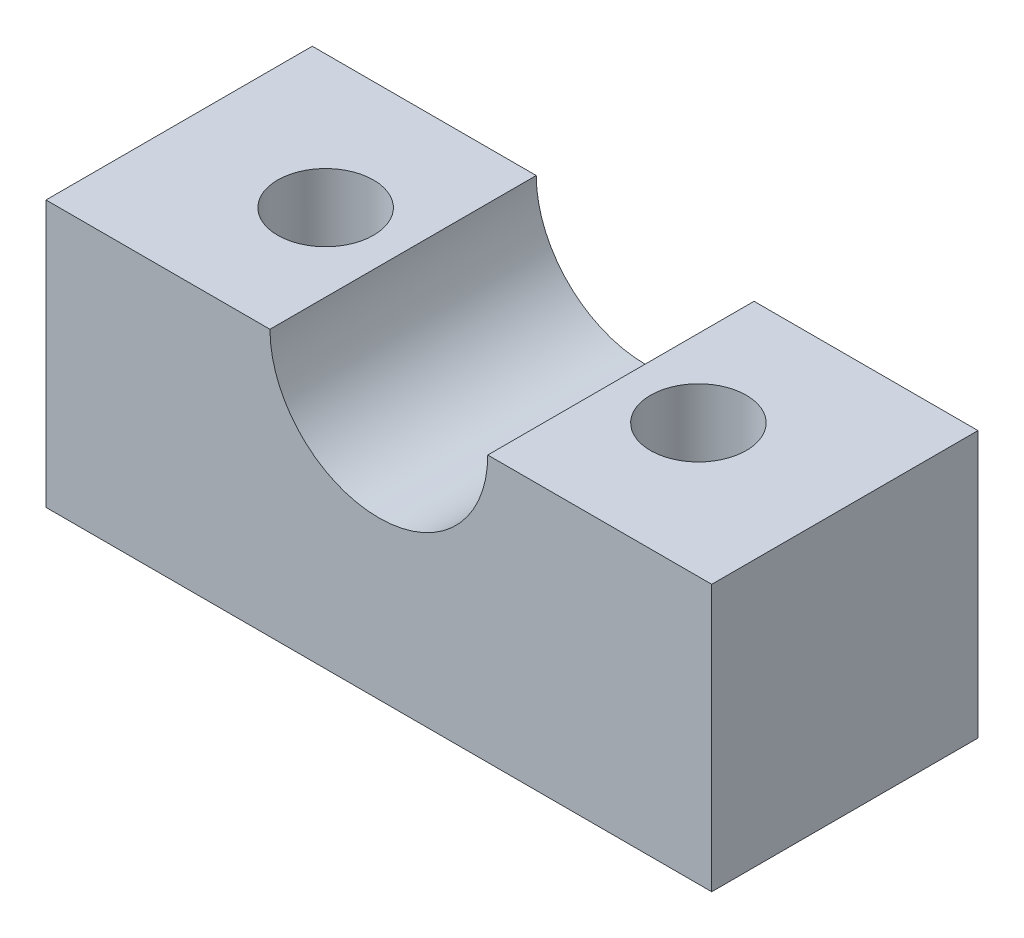
ISO-10303-21;
HEADER;
FILE_DESCRIPTION(('STEP AP214'),'2;1');
FILE_NAME('part.step','',(''),(''),'','','');
FILE_SCHEMA(('AUTOMOTIVE_DESIGN { 1 0 10303 214 1 1 1 1 }'));
ENDSEC;
DATA;
#1=APPLICATION_CONTEXT('core data for automotive mechanical design processes');
#2=APPLICATION_PROTOCOL_DEFINITION('international standard','automotive_design',2000,#1);
#3=PRODUCT_CONTEXT('',#1,'mechanical');
#4=PRODUCT('Part','Part','',(#3));
#5=PRODUCT_RELATED_PRODUCT_CATEGORY('part','',(#4));
#6=PRODUCT_DEFINITION_FORMATION('','',#4);
#7=PRODUCT_DEFINITION_CONTEXT('part definition',#1,'design');
#8=PRODUCT_DEFINITION('design','',#6,#7);
#9=PRODUCT_DEFINITION_SHAPE('','',#8);
#10=(LENGTH_UNIT() NAMED_UNIT(*) SI_UNIT(.MILLI.,.METRE.));
#11=(NAMED_UNIT(*) PLANE_ANGLE_UNIT() SI_UNIT($,.RADIAN.));
#12=(NAMED_UNIT(*) SI_UNIT($,.STERADIAN.) SOLID_ANGLE_UNIT());
#13=UNCERTAINTY_MEASURE_WITH_UNIT(LENGTH_MEASURE(1.E-05),#10,'distance_accuracy_value','');
#14=(GEOMETRIC_REPRESENTATION_CONTEXT(3) GLOBAL_UNCERTAINTY_ASSIGNED_CONTEXT((#13)) GLOBAL_UNIT_ASSIGNED_CONTEXT((#10,
#11,#12)) REPRESENTATION_CONTEXT('',''));
#15=CARTESIAN_POINT('',(0.,0.,0.));
#16=DIRECTION('',(0.,0.,1.));
#17=DIRECTION('',(1.,0.,0.));
#18=AXIS2_PLACEMENT_3D('',#15,#16,#17);
#19=CARTESIAN_POINT('',(0.,5.,5.));
#20=DIRECTION('',(0.,0.,-1.));
#21=DIRECTION('',(-1.,0.,0.));
#22=AXIS2_PLACEMENT_3D('',#19,#20,#21);
#23=CYLINDRICAL_SURFACE('',#22,4.09);
#24=CARTESIAN_POINT('',(0.,5.,-5.));
#25=DIRECTION('',(0.,0.,1.));
#26=DIRECTION('',(1.,0.,0.));
#27=AXIS2_PLACEMENT_3D('',#24,#25,#26);
#28=CIRCLE('',#27,4.09);
#29=CARTESIAN_POINT('',(-4.09,5.,-5.));
#30=VERTEX_POINT('',#29);
#31=CARTESIAN_POINT('',(4.09,5.,-5.));
#32=VERTEX_POINT('',#31);
#33=EDGE_CURVE('E115',#30,#32,#28,.T.);
#34=ORIENTED_EDGE('',*,*,#33,.F.);
#35=DIRECTION('',(0.,0.,-1.));
#36=VECTOR('',#35,1.);
#37=CARTESIAN_POINT('',(-4.09,5.,5.));
#38=LINE('',#37,#36);
#39=CARTESIAN_POINT('',(-4.09,5.,5.));
#40=VERTEX_POINT('',#39);
#41=EDGE_CURVE('E11',#40,#30,#38,.T.);
#42=ORIENTED_EDGE('',*,*,#41,.F.);
#43=CARTESIAN_POINT('',(0.,5.,5.));
#44=DIRECTION('',(0.,0.,1.));
#45=DIRECTION('',(1.,0.,0.));
#46=AXIS2_PLACEMENT_3D('',#43,#44,#45);
#47=CIRCLE('',#46,4.09);
#48=CARTESIAN_POINT('',(4.09,5.,5.));
#49=VERTEX_POINT('',#48);
#50=EDGE_CURVE('E130',#40,#49,#47,.T.);
#51=ORIENTED_EDGE('',*,*,#50,.T.);
#52=DIRECTION('',(0.,0.,-1.));
#53=VECTOR('',#52,1.);
#54=CARTESIAN_POINT('',(4.09,5.,5.));
#55=LINE('',#54,#53);
#56=EDGE_CURVE('E36',#49,#32,#55,.T.);
#57=ORIENTED_EDGE('',*,*,#56,.T.);
#58=EDGE_LOOP('',(#34,#42,#51,#57));
#59=FACE_BOUND('',#58,.T.);
#60=ADVANCED_FACE('F33',(#59),#23,.F.);
#61=CARTESIAN_POINT('',(-12.5,5.,5.));
#62=DIRECTION('',(0.,1.,0.));
#63=DIRECTION('',(0.,0.,1.));
#64=AXIS2_PLACEMENT_3D('',#61,#62,#63);
#65=PLANE('',#64);
#66=CARTESIAN_POINT('',(-7.,5.,0.));
#67=DIRECTION('',(0.,1.,0.));
#68=DIRECTION('',(0.,0.,1.));
#69=AXIS2_PLACEMENT_3D('',#66,#67,#68);
#70=CIRCLE('',#69,1.8);
#71=CARTESIAN_POINT('',(-7.,5.,1.8));
#72=VERTEX_POINT('',#71);
#73=EDGE_CURVE('E170',#72,#72,#70,.F.);
#74=ORIENTED_EDGE('',*,*,#73,.T.);
#75=EDGE_LOOP('',(#74));
#76=FACE_BOUND('',#75,.T.);
#77=DIRECTION('',(1.,0.,0.));
#78=VECTOR('',#77,1.);
#79=CARTESIAN_POINT('',(-12.5,5.,-5.));
#80=LINE('',#79,#78);
#81=CARTESIAN_POINT('',(-12.5,5.,-5.));
#82=VERTEX_POINT('',#81);
#83=EDGE_CURVE('E128',#82,#30,#80,.T.);
#84=ORIENTED_EDGE('',*,*,#83,.F.);
#85=DIRECTION('',(0.,0.,-1.));
#86=VECTOR('',#85,1.);
#87=CARTESIAN_POINT('',(-12.5,5.,5.));
#88=LINE('',#87,#86);
#89=CARTESIAN_POINT('',(-12.5,5.,5.));
#90=VERTEX_POINT('',#89);
#91=EDGE_CURVE('E42',#90,#82,#88,.T.);
#92=ORIENTED_EDGE('',*,*,#91,.F.);
#93=DIRECTION('',(1.,0.,0.));
#94=VECTOR('',#93,1.);
#95=CARTESIAN_POINT('',(-12.5,5.,5.));
#96=LINE('',#95,#94);
#97=EDGE_CURVE('E110',#90,#40,#96,.T.);
#98=ORIENTED_EDGE('',*,*,#97,.T.);
#99=ORIENTED_EDGE('',*,*,#41,.T.);
#100=EDGE_LOOP('',(#84,#92,#98,#99));
#101=FACE_BOUND('',#100,.T.);
#102=ADVANCED_FACE('F139',(#76,#101),#65,.T.);
#103=CARTESIAN_POINT('',(-12.5,-5.,5.));
#104=DIRECTION('',(-1.,0.,0.));
#105=DIRECTION('',(0.,0.,1.));
#106=AXIS2_PLACEMENT_3D('',#103,#104,#105);
#107=PLANE('',#106);
#108=DIRECTION('',(0.,1.,0.));
#109=VECTOR('',#108,1.);
#110=CARTESIAN_POINT('',(-12.5,-5.,-5.));
#111=LINE('',#110,#109);
#112=CARTESIAN_POINT('',(-12.5,-5.,-5.));
#113=VERTEX_POINT('',#112);
#114=EDGE_CURVE('E96',#113,#82,#111,.T.);
#115=ORIENTED_EDGE('',*,*,#114,.F.);
#116=DIRECTION('',(0.,0.,-1.));
#117=VECTOR('',#116,1.);
#118=CARTESIAN_POINT('',(-12.5,-5.,5.));
#119=LINE('',#118,#117);
#120=CARTESIAN_POINT('',(-12.5,-5.,5.));
#121=VERTEX_POINT('',#120);
#122=EDGE_CURVE('E90',#121,#113,#119,.T.);
#123=ORIENTED_EDGE('',*,*,#122,.F.);
#124=DIRECTION('',(0.,1.,0.));
#125=VECTOR('',#124,1.);
#126=CARTESIAN_POINT('',(-12.5,-5.,5.));
#127=LINE('',#126,#125);
#128=EDGE_CURVE('E94',#121,#90,#127,.T.);
#129=ORIENTED_EDGE('',*,*,#128,.T.);
#130=ORIENTED_EDGE('',*,*,#91,.T.);
#131=EDGE_LOOP('',(#115,#123,#129,#130));
#132=FACE_BOUND('',#131,.T.);
#133=ADVANCED_FACE('F92',(#132),#107,.T.);
#134=CARTESIAN_POINT('',(-12.5,-5.,5.));
#135=DIRECTION('',(0.,1.,0.));
#136=DIRECTION('',(0.,0.,1.));
#137=AXIS2_PLACEMENT_3D('',#134,#135,#136);
#138=PLANE('',#137);
#139=CARTESIAN_POINT('',(7.,-5.,0.));
#140=DIRECTION('',(0.,1.,0.));
#141=DIRECTION('',(0.,0.,1.));
#142=AXIS2_PLACEMENT_3D('',#139,#140,#141);
#143=CIRCLE('',#142,1.8);
#144=CARTESIAN_POINT('',(7.,-5.,1.8));
#145=VERTEX_POINT('',#144);
#146=EDGE_CURVE('E167',#145,#145,#143,.T.);
#147=ORIENTED_EDGE('',*,*,#146,.T.);
#148=EDGE_LOOP('',(#147));
#149=FACE_BOUND('',#148,.T.);
#150=CARTESIAN_POINT('',(-7.,-5.,0.));
#151=DIRECTION('',(0.,-1.,0.));
#152=DIRECTION('',(0.,0.,-1.));
#153=AXIS2_PLACEMENT_3D('',#150,#151,#152);
#154=CIRCLE('',#153,1.8);
#155=CARTESIAN_POINT('',(-7.,-5.,-1.8));
#156=VERTEX_POINT('',#155);
#157=EDGE_CURVE('E119',#156,#156,#154,.T.);
#158=ORIENTED_EDGE('',*,*,#157,.F.);
#159=EDGE_LOOP('',(#158));
#160=FACE_BOUND('',#159,.T.);
#161=DIRECTION('',(1.,0.,0.));
#162=VECTOR('',#161,1.);
#163=CARTESIAN_POINT('',(-12.5,-5.,-5.));
#164=LINE('',#163,#162);
#165=CARTESIAN_POINT('',(12.5,-5.,-5.));
#166=VERTEX_POINT('',#165);
#167=EDGE_CURVE('E125',#113,#166,#164,.T.);
#168=ORIENTED_EDGE('',*,*,#167,.T.);
#169=DIRECTION('',(0.,0.,-1.));
#170=VECTOR('',#169,1.);
#171=CARTESIAN_POINT('',(12.5,-5.,5.));
#172=LINE('',#171,#170);
#173=CARTESIAN_POINT('',(12.5,-5.,5.));
#174=VERTEX_POINT('',#173);
#175=EDGE_CURVE('E99',#174,#166,#172,.T.);
#176=ORIENTED_EDGE('',*,*,#175,.F.);
#177=DIRECTION('',(1.,0.,0.));
#178=VECTOR('',#177,1.);
#179=CARTESIAN_POINT('',(-12.5,-5.,5.));
#180=LINE('',#179,#178);
#181=EDGE_CURVE('E102',#121,#174,#180,.T.);
#182=ORIENTED_EDGE('',*,*,#181,.F.);
#183=ORIENTED_EDGE('',*,*,#122,.T.);
#184=EDGE_LOOP('',(#168,#176,#182,#183));
#185=FACE_BOUND('',#184,.T.);
#186=ADVANCED_FACE('F103',(#149,#160,#185),#138,.F.);
#187=CARTESIAN_POINT('',(12.5,-5.,5.));
#188=DIRECTION('',(-1.,0.,0.));
#189=DIRECTION('',(0.,0.,1.));
#190=AXIS2_PLACEMENT_3D('',#187,#188,#189);
#191=PLANE('',#190);
#192=DIRECTION('',(0.,1.,0.));
#193=VECTOR('',#192,1.);
#194=CARTESIAN_POINT('',(12.5,-5.,-5.));
#195=LINE('',#194,#193);
#196=CARTESIAN_POINT('',(12.5,5.,-5.));
#197=VERTEX_POINT('',#196);
#198=EDGE_CURVE('E122',#166,#197,#195,.T.);
#199=ORIENTED_EDGE('',*,*,#198,.T.);
#200=DIRECTION('',(0.,0.,-1.));
#201=VECTOR('',#200,1.);
#202=CARTESIAN_POINT('',(12.5,5.,5.));
#203=LINE('',#202,#201);
#204=CARTESIAN_POINT('',(12.5,5.,5.));
#205=VERTEX_POINT('',#204);
#206=EDGE_CURVE('E133',#205,#197,#203,.T.);
#207=ORIENTED_EDGE('',*,*,#206,.F.);
#208=DIRECTION('',(0.,1.,0.));
#209=VECTOR('',#208,1.);
#210=CARTESIAN_POINT('',(12.5,-5.,5.));
#211=LINE('',#210,#209);
#212=EDGE_CURVE('E107',#174,#205,#211,.T.);
#213=ORIENTED_EDGE('',*,*,#212,.F.);
#214=ORIENTED_EDGE('',*,*,#175,.T.);
#215=EDGE_LOOP('',(#199,#207,#213,#214));
#216=FACE_BOUND('',#215,.T.);
#217=ADVANCED_FACE('F154',(#216),#191,.F.);
#218=CARTESIAN_POINT('',(4.09,5.,5.));
#219=DIRECTION('',(0.,1.,0.));
#220=DIRECTION('',(-1.,0.,0.));
#221=AXIS2_PLACEMENT_3D('',#218,#219,#220);
#222=PLANE('',#221);
#223=CARTESIAN_POINT('',(7.,5.,0.));
#224=DIRECTION('',(0.,1.,0.));
#225=DIRECTION('',(-1.,0.,0.));
#226=AXIS2_PLACEMENT_3D('',#223,#224,#225);
#227=CIRCLE('',#226,1.8);
#228=CARTESIAN_POINT('',(5.2,5.,0.));
#229=VERTEX_POINT('',#228);
#230=EDGE_CURVE('E165',#229,#229,#227,.T.);
#231=ORIENTED_EDGE('',*,*,#230,.F.);
#232=EDGE_LOOP('',(#231));
#233=FACE_BOUND('',#232,.T.);
#234=DIRECTION('',(1.,0.,0.));
#235=VECTOR('',#234,1.);
#236=CARTESIAN_POINT('',(4.09,5.,-5.));
#237=LINE('',#236,#235);
#238=EDGE_CURVE('E118',#32,#197,#237,.T.);
#239=ORIENTED_EDGE('',*,*,#238,.F.);
#240=ORIENTED_EDGE('',*,*,#56,.F.);
#241=DIRECTION('',(1.,0.,0.));
#242=VECTOR('',#241,1.);
#243=CARTESIAN_POINT('',(4.09,5.,5.));
#244=LINE('',#243,#242);
#245=EDGE_CURVE('E177',#49,#205,#244,.T.);
#246=ORIENTED_EDGE('',*,*,#245,.T.);
#247=ORIENTED_EDGE('',*,*,#206,.T.);
#248=EDGE_LOOP('',(#239,#240,#246,#247));
#249=FACE_BOUND('',#248,.T.);
#250=ADVANCED_FACE('F135',(#233,#249),#222,.T.);
#251=CARTESIAN_POINT('',(0.,5.,5.));
#252=DIRECTION('',(0.,0.,1.));
#253=DIRECTION('',(1.,0.,0.));
#254=AXIS2_PLACEMENT_3D('',#251,#252,#253);
#255=PLANE('',#254);
#256=ORIENTED_EDGE('',*,*,#50,.F.);
#257=ORIENTED_EDGE('',*,*,#97,.F.);
#258=ORIENTED_EDGE('',*,*,#128,.F.);
#259=ORIENTED_EDGE('',*,*,#181,.T.);
#260=ORIENTED_EDGE('',*,*,#212,.T.);
#261=ORIENTED_EDGE('',*,*,#245,.F.);
#262=EDGE_LOOP('',(#256,#257,#258,#259,#260,#261));
#263=FACE_BOUND('',#262,.T.);
#264=ADVANCED_FACE('F109',(#263),#255,.T.);
#265=CARTESIAN_POINT('',(0.,5.,-5.));
#266=DIRECTION('',(0.,0.,1.));
#267=DIRECTION('',(1.,0.,0.));
#268=AXIS2_PLACEMENT_3D('',#265,#266,#267);
#269=PLANE('',#268);
#270=ORIENTED_EDGE('',*,*,#33,.T.);
#271=ORIENTED_EDGE('',*,*,#238,.T.);
#272=ORIENTED_EDGE('',*,*,#198,.F.);
#273=ORIENTED_EDGE('',*,*,#167,.F.);
#274=ORIENTED_EDGE('',*,*,#114,.T.);
#275=ORIENTED_EDGE('',*,*,#83,.T.);
#276=EDGE_LOOP('',(#270,#271,#272,#273,#274,#275));
#277=FACE_BOUND('',#276,.T.);
#278=ADVANCED_FACE('F138',(#277),#269,.F.);
#279=CARTESIAN_POINT('',(-7.,5.001,0.));
#280=DIRECTION('',(0.,-1.,0.));
#281=DIRECTION('',(0.,0.,-1.));
#282=AXIS2_PLACEMENT_3D('',#279,#280,#281);
#283=CYLINDRICAL_SURFACE('',#282,1.8);
#284=ORIENTED_EDGE('',*,*,#73,.F.);
#285=EDGE_LOOP('',(#284));
#286=FACE_BOUND('',#285,.T.);
#287=ORIENTED_EDGE('',*,*,#157,.T.);
#288=EDGE_LOOP('',(#287));
#289=FACE_BOUND('',#288,.T.);
#290=ADVANCED_FACE('F180',(#286,#289),#283,.F.);
#291=CARTESIAN_POINT('',(7.,5.001,0.));
#292=DIRECTION('',(0.,-1.,0.));
#293=DIRECTION('',(0.,0.,-1.));
#294=AXIS2_PLACEMENT_3D('',#291,#292,#293);
#295=CYLINDRICAL_SURFACE('',#294,1.8);
#296=ORIENTED_EDGE('',*,*,#230,.T.);
#297=EDGE_LOOP('',(#296));
#298=FACE_BOUND('',#297,.T.);
#299=ORIENTED_EDGE('',*,*,#146,.F.);
#300=EDGE_LOOP('',(#299));
#301=FACE_BOUND('',#300,.T.);
#302=ADVANCED_FACE('F183',(#298,#301),#295,.F.);
#303=CLOSED_SHELL('',(#60,#102,#133,#186,#217,#250,#264,#278,#290,#302));
#304=MANIFOLD_SOLID_BREP('B2',#303);
#305=ADVANCED_BREP_SHAPE_REPRESENTATION('',(#18,#304),#14);
#306=SHAPE_DEFINITION_REPRESENTATION(#9,#305);
ENDSEC;
END-ISO-10303-21;
